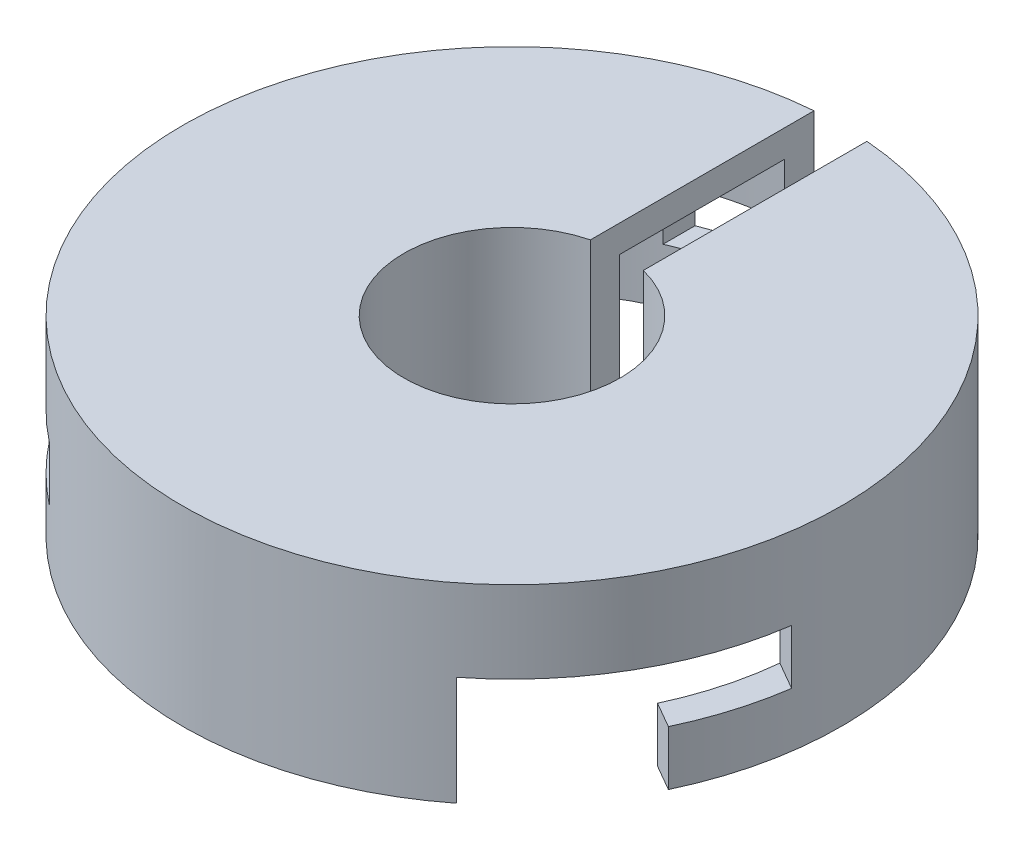
ISO-10303-21;
HEADER;
FILE_DESCRIPTION(('STEP AP214'),'2;1');
FILE_NAME('part.step','',(''),(''),'','','');
FILE_SCHEMA(('AUTOMOTIVE_DESIGN { 1 0 10303 214 1 1 1 1 }'));
ENDSEC;
DATA;
#1=APPLICATION_CONTEXT('core data for automotive mechanical design processes');
#2=APPLICATION_PROTOCOL_DEFINITION('international standard','automotive_design',2000,#1);
#3=PRODUCT_CONTEXT('',#1,'mechanical');
#4=PRODUCT('Part','Part','',(#3));
#5=PRODUCT_RELATED_PRODUCT_CATEGORY('part','',(#4));
#6=PRODUCT_DEFINITION_FORMATION('','',#4);
#7=PRODUCT_DEFINITION_CONTEXT('part definition',#1,'design');
#8=PRODUCT_DEFINITION('design','',#6,#7);
#9=PRODUCT_DEFINITION_SHAPE('','',#8);
#10=(LENGTH_UNIT() NAMED_UNIT(*) SI_UNIT(.MILLI.,.METRE.));
#11=(NAMED_UNIT(*) PLANE_ANGLE_UNIT() SI_UNIT($,.RADIAN.));
#12=(NAMED_UNIT(*) SI_UNIT($,.STERADIAN.) SOLID_ANGLE_UNIT());
#13=UNCERTAINTY_MEASURE_WITH_UNIT(LENGTH_MEASURE(1.E-05),#10,'distance_accuracy_value','');
#14=(GEOMETRIC_REPRESENTATION_CONTEXT(3) GLOBAL_UNCERTAINTY_ASSIGNED_CONTEXT((#13)) GLOBAL_UNIT_ASSIGNED_CONTEXT((#10,
#11,#12)) REPRESENTATION_CONTEXT('',''));
#15=CARTESIAN_POINT('',(0.,0.,0.));
#16=DIRECTION('',(0.,0.,1.));
#17=DIRECTION('',(1.,0.,0.));
#18=AXIS2_PLACEMENT_3D('',#15,#16,#17);
#19=CARTESIAN_POINT('',(-2.24999999999995,-7.,3.89711431702989));
#20=DIRECTION('',(0.5,0.,-0.866025403784439));
#21=DIRECTION('',(-0.866025403784439,0.,-0.5));
#22=AXIS2_PLACEMENT_3D('',#19,#20,#21);
#23=PLANE('',#22);
#24=DIRECTION('',(0.,1.,0.));
#25=VECTOR('',#24,1.);
#26=CARTESIAN_POINT('',(6.44266932535773,-7.,8.91582929200156));
#27=LINE('',#26,#25);
#28=CARTESIAN_POINT('',(6.44266932535773,-7.,8.91582929200156));
#29=VERTEX_POINT('',#28);
#30=CARTESIAN_POINT('',(6.44266932535773,-3.,8.91582929200156));
#31=VERTEX_POINT('',#30);
#32=EDGE_CURVE('E52',#29,#31,#27,.T.);
#33=ORIENTED_EDGE('',*,*,#32,.T.);
#34=DIRECTION('',(-0.866025403784439,0.,-0.5));
#35=VECTOR('',#34,1.);
#36=CARTESIAN_POINT('',(-2.24999999999995,-3.,3.89711431702989));
#37=LINE('',#36,#35);
#38=CARTESIAN_POINT('',(7.46078785093315,-3.,9.50364029680947));
#39=VERTEX_POINT('',#38);
#40=EDGE_CURVE('E57',#39,#31,#37,.T.);
#41=ORIENTED_EDGE('',*,*,#40,.F.);
#42=DIRECTION('',(0.,1.,0.));
#43=VECTOR('',#42,1.);
#44=CARTESIAN_POINT('',(7.46078785093315,-7.,9.50364029680947));
#45=LINE('',#44,#43);
#46=CARTESIAN_POINT('',(7.46078785093315,-7.,9.50364029680947));
#47=VERTEX_POINT('',#46);
#48=EDGE_CURVE('E381',#47,#39,#45,.T.);
#49=ORIENTED_EDGE('',*,*,#48,.F.);
#50=DIRECTION('',(-0.866025403784439,0.,-0.5));
#51=VECTOR('',#50,1.);
#52=CARTESIAN_POINT('',(-2.24999999999995,-7.,3.89711431702989));
#53=LINE('',#52,#51);
#54=EDGE_CURVE('E371',#47,#29,#53,.T.);
#55=ORIENTED_EDGE('',*,*,#54,.T.);
#56=EDGE_LOOP('',(#33,#41,#49,#55));
#57=FACE_BOUND('',#56,.T.);
#58=ADVANCED_FACE('F35',(#57),#23,.T.);
#59=CARTESIAN_POINT('',(2.25000000000006,-7.,-3.89711431703006));
#60=DIRECTION('',(0.500000000000001,0.,-0.866025403784438));
#61=DIRECTION('',(-0.866025403784438,0.,-0.500000000000001));
#62=AXIS2_PLACEMENT_3D('',#59,#60,#61);
#63=PLANE('',#62);
#64=DIRECTION('',(0.,1.,0.));
#65=VECTOR('',#64,1.);
#66=CARTESIAN_POINT('',(10.9426693253575,-7.,1.12160065794149));
#67=LINE('',#66,#65);
#68=CARTESIAN_POINT('',(10.9426693253575,-5.,1.12160065794149));
#69=VERTEX_POINT('',#68);
#70=CARTESIAN_POINT('',(10.9426693253575,-3.,1.12160065794149));
#71=VERTEX_POINT('',#70);
#72=EDGE_CURVE('E358',#69,#71,#67,.T.);
#73=ORIENTED_EDGE('',*,*,#72,.F.);
#74=DIRECTION('',(-0.866025403784438,0.,-0.500000000000001));
#75=VECTOR('',#74,1.);
#76=CARTESIAN_POINT('',(2.25000000000006,-5.,-3.89711431703006));
#77=LINE('',#76,#75);
#78=CARTESIAN_POINT('',(11.9607878509331,-5.,1.70941166274948));
#79=VERTEX_POINT('',#78);
#80=EDGE_CURVE('E255',#79,#69,#77,.T.);
#81=ORIENTED_EDGE('',*,*,#80,.F.);
#82=DIRECTION('',(0.,1.,0.));
#83=VECTOR('',#82,1.);
#84=CARTESIAN_POINT('',(11.9607878509331,-7.,1.70941166274948));
#85=LINE('',#84,#83);
#86=CARTESIAN_POINT('',(11.9607878509331,-3.,1.70941166274948));
#87=VERTEX_POINT('',#86);
#88=EDGE_CURVE('E357',#79,#87,#85,.T.);
#89=ORIENTED_EDGE('',*,*,#88,.T.);
#90=DIRECTION('',(-0.866025403784438,0.,-0.500000000000001));
#91=VECTOR('',#90,1.);
#92=CARTESIAN_POINT('',(2.25000000000006,-3.,-3.89711431703006));
#93=LINE('',#92,#91);
#94=EDGE_CURVE('E285',#87,#71,#93,.T.);
#95=ORIENTED_EDGE('',*,*,#94,.T.);
#96=EDGE_LOOP('',(#73,#81,#89,#95));
#97=FACE_BOUND('',#96,.T.);
#98=ADVANCED_FACE('F459',(#97),#63,.F.);
#99=CARTESIAN_POINT('',(2.25000000000045,-7.,3.89711431703076));
#100=DIRECTION('',(0.5,0.,0.866025403784439));
#101=DIRECTION('',(0.866025403784439,0.,-0.5));
#102=AXIS2_PLACEMENT_3D('',#99,#100,#101);
#103=PLANE('',#102);
#104=DIRECTION('',(0.,1.,0.));
#105=VECTOR('',#104,1.);
#106=CARTESIAN_POINT('',(-6.44266932535678,-7.,8.91582929200216));
#107=LINE('',#106,#105);
#108=CARTESIAN_POINT('',(-6.44266932535678,-5.,8.91582929200216));
#109=VERTEX_POINT('',#108);
#110=CARTESIAN_POINT('',(-6.44266932535678,-3.,8.91582929200216));
#111=VERTEX_POINT('',#110);
#112=EDGE_CURVE('E377',#109,#111,#107,.T.);
#113=ORIENTED_EDGE('',*,*,#112,.F.);
#114=DIRECTION('',(0.866025403784439,0.,-0.5));
#115=VECTOR('',#114,1.);
#116=CARTESIAN_POINT('',(2.25000000000045,-5.,3.89711431703076));
#117=LINE('',#116,#115);
#118=CARTESIAN_POINT('',(-7.4607878509323,-5.,9.50364029681013));
#119=VERTEX_POINT('',#118);
#120=EDGE_CURVE('E273',#119,#109,#117,.T.);
#121=ORIENTED_EDGE('',*,*,#120,.F.);
#122=DIRECTION('',(0.,1.,0.));
#123=VECTOR('',#122,1.);
#124=CARTESIAN_POINT('',(-7.4607878509323,-7.,9.50364029681013));
#125=LINE('',#124,#123);
#126=CARTESIAN_POINT('',(-7.4607878509323,-3.,9.50364029681013));
#127=VERTEX_POINT('',#126);
#128=EDGE_CURVE('E375',#119,#127,#125,.T.);
#129=ORIENTED_EDGE('',*,*,#128,.T.);
#130=DIRECTION('',(0.866025403784439,0.,-0.5));
#131=VECTOR('',#130,1.);
#132=CARTESIAN_POINT('',(2.25000000000045,-3.,3.89711431703076));
#133=LINE('',#132,#131);
#134=EDGE_CURVE('E297',#127,#111,#133,.T.);
#135=ORIENTED_EDGE('',*,*,#134,.T.);
#136=EDGE_LOOP('',(#113,#121,#129,#135));
#137=FACE_BOUND('',#136,.T.);
#138=ADVANCED_FACE('F464',(#137),#103,.F.);
#139=CARTESIAN_POINT('',(-2.24999999999955,-7.,-3.89711431702919));
#140=DIRECTION('',(0.5,0.,0.866025403784439));
#141=DIRECTION('',(0.866025403784439,0.,-0.5));
#142=AXIS2_PLACEMENT_3D('',#139,#140,#141);
#143=PLANE('',#142);
#144=DIRECTION('',(0.,1.,0.));
#145=VECTOR('',#144,1.);
#146=CARTESIAN_POINT('',(-10.942669325357,-7.,1.12160065794233));
#147=LINE('',#146,#145);
#148=CARTESIAN_POINT('',(-10.942669325357,-7.,1.12160065794233));
#149=VERTEX_POINT('',#148);
#150=CARTESIAN_POINT('',(-10.942669325357,-3.,1.12160065794233));
#151=VERTEX_POINT('',#150);
#152=EDGE_CURVE('E344',#149,#151,#147,.T.);
#153=ORIENTED_EDGE('',*,*,#152,.T.);
#154=DIRECTION('',(0.866025403784439,0.,-0.5));
#155=VECTOR('',#154,1.);
#156=CARTESIAN_POINT('',(-2.24999999999955,-3.,-3.89711431702919));
#157=LINE('',#156,#155);
#158=CARTESIAN_POINT('',(-11.9607878509329,-3.,1.70941166275055));
#159=VERTEX_POINT('',#158);
#160=EDGE_CURVE('E291',#159,#151,#157,.T.);
#161=ORIENTED_EDGE('',*,*,#160,.F.);
#162=DIRECTION('',(0.,1.,0.));
#163=VECTOR('',#162,1.);
#164=CARTESIAN_POINT('',(-11.9607878509329,-7.,1.70941166275055));
#165=LINE('',#164,#163);
#166=CARTESIAN_POINT('',(-11.9607878509329,-7.,1.70941166275055));
#167=VERTEX_POINT('',#166);
#168=EDGE_CURVE('E347',#167,#159,#165,.T.);
#169=ORIENTED_EDGE('',*,*,#168,.F.);
#170=DIRECTION('',(0.866025403784439,0.,-0.5));
#171=VECTOR('',#170,1.);
#172=CARTESIAN_POINT('',(-2.24999999999955,-7.,-3.89711431702919));
#173=LINE('',#172,#171);
#174=EDGE_CURVE('E217',#167,#149,#173,.T.);
#175=ORIENTED_EDGE('',*,*,#174,.T.);
#176=EDGE_LOOP('',(#153,#161,#169,#175));
#177=FACE_BOUND('',#176,.T.);
#178=ADVANCED_FACE('F475',(#177),#143,.T.);
#179=CARTESIAN_POINT('',(4.5,-7.,0.));
#180=DIRECTION('',(-1.,0.,0.));
#181=DIRECTION('',(0.,0.,1.));
#182=AXIS2_PLACEMENT_3D('',#179,#180,#181);
#183=PLANE('',#182);
#184=DIRECTION('',(0.,1.,0.));
#185=VECTOR('',#184,1.);
#186=CARTESIAN_POINT('',(4.5,-7.,-10.0374299499424));
#187=LINE('',#186,#185);
#188=CARTESIAN_POINT('',(4.5,-7.,-10.0374299499424));
#189=VERTEX_POINT('',#188);
#190=CARTESIAN_POINT('',(4.5,-3.,-10.0374299499424));
#191=VERTEX_POINT('',#190);
#192=EDGE_CURVE('E361',#189,#191,#187,.T.);
#193=ORIENTED_EDGE('',*,*,#192,.T.);
#194=DIRECTION('',(0.,0.,1.));
#195=VECTOR('',#194,1.);
#196=CARTESIAN_POINT('',(4.5,-3.,0.));
#197=LINE('',#196,#195);
#198=CARTESIAN_POINT('',(4.5,-3.,-11.2130519595591));
#199=VERTEX_POINT('',#198);
#200=EDGE_CURVE('E303',#199,#191,#197,.T.);
#201=ORIENTED_EDGE('',*,*,#200,.F.);
#202=DIRECTION('',(0.,1.,0.));
#203=VECTOR('',#202,1.);
#204=CARTESIAN_POINT('',(4.5,-7.,-11.2130519595591));
#205=LINE('',#204,#203);
#206=CARTESIAN_POINT('',(4.5,-7.,-11.2130519595591));
#207=VERTEX_POINT('',#206);
#208=EDGE_CURVE('E364',#207,#199,#205,.T.);
#209=ORIENTED_EDGE('',*,*,#208,.F.);
#210=DIRECTION('',(0.,0.,1.));
#211=VECTOR('',#210,1.);
#212=CARTESIAN_POINT('',(4.5,-7.,0.));
#213=LINE('',#212,#211);
#214=EDGE_CURVE('E352',#207,#189,#213,.T.);
#215=ORIENTED_EDGE('',*,*,#214,.T.);
#216=EDGE_LOOP('',(#193,#201,#209,#215));
#217=FACE_BOUND('',#216,.T.);
#218=ADVANCED_FACE('F432',(#217),#183,.T.);
#219=CARTESIAN_POINT('',(-4.5,-7.,0.));
#220=DIRECTION('',(-1.,0.,0.));
#221=DIRECTION('',(0.,0.,1.));
#222=AXIS2_PLACEMENT_3D('',#219,#220,#221);
#223=PLANE('',#222);
#224=DIRECTION('',(0.,1.,0.));
#225=VECTOR('',#224,1.);
#226=CARTESIAN_POINT('',(-4.5,-7.,-10.0374299499424));
#227=LINE('',#226,#225);
#228=CARTESIAN_POINT('',(-4.5,-5.,-10.0374299499424));
#229=VERTEX_POINT('',#228);
#230=CARTESIAN_POINT('',(-4.5,-3.,-10.0374299499424));
#231=VERTEX_POINT('',#230);
#232=EDGE_CURVE('E341',#229,#231,#227,.T.);
#233=ORIENTED_EDGE('',*,*,#232,.F.);
#234=DIRECTION('',(0.,0.,1.));
#235=VECTOR('',#234,1.);
#236=CARTESIAN_POINT('',(-4.5,-5.,0.));
#237=LINE('',#236,#235);
#238=CARTESIAN_POINT('',(-4.5,-5.,-11.2130519595591));
#239=VERTEX_POINT('',#238);
#240=EDGE_CURVE('E236',#239,#229,#237,.T.);
#241=ORIENTED_EDGE('',*,*,#240,.F.);
#242=DIRECTION('',(0.,1.,0.));
#243=VECTOR('',#242,1.);
#244=CARTESIAN_POINT('',(-4.5,-7.,-11.2130519595591));
#245=LINE('',#244,#243);
#246=CARTESIAN_POINT('',(-4.5,-3.,-11.2130519595591));
#247=VERTEX_POINT('',#246);
#248=EDGE_CURVE('E340',#239,#247,#245,.T.);
#249=ORIENTED_EDGE('',*,*,#248,.T.);
#250=DIRECTION('',(0.,0.,1.));
#251=VECTOR('',#250,1.);
#252=CARTESIAN_POINT('',(-4.5,-3.,0.));
#253=LINE('',#252,#251);
#254=EDGE_CURVE('E326',#247,#231,#253,.T.);
#255=ORIENTED_EDGE('',*,*,#254,.T.);
#256=EDGE_LOOP('',(#233,#241,#249,#255));
#257=FACE_BOUND('',#256,.T.);
#258=ADVANCED_FACE('F481',(#257),#223,.F.);
#259=CARTESIAN_POINT('',(0.,-7.,0.));
#260=DIRECTION('',(0.,1.,0.));
#261=DIRECTION('',(0.,0.,1.));
#262=AXIS2_PLACEMENT_3D('',#259,#260,#261);
#263=CYLINDRICAL_SURFACE('',#262,5.);
#264=DIRECTION('',(0.,1.,0.));
#265=VECTOR('',#264,1.);
#266=CARTESIAN_POINT('',(0.970071849064033,-7.,-4.90499343604591));
#267=LINE('',#266,#265);
#268=CARTESIAN_POINT('',(0.970071849064033,-7.,-4.90499343604591));
#269=VERTEX_POINT('',#268);
#270=CARTESIAN_POINT('',(0.970071849064033,-1.,-4.90499343604591));
#271=VERTEX_POINT('',#270);
#272=EDGE_CURVE('E44',#269,#271,#267,.T.);
#273=ORIENTED_EDGE('',*,*,#272,.T.);
#274=CARTESIAN_POINT('',(0.,-1.,0.));
#275=DIRECTION('',(0.,1.,0.));
#276=DIRECTION('',(0.,0.,1.));
#277=AXIS2_PLACEMENT_3D('',#274,#275,#276);
#278=CIRCLE('',#277,5.);
#279=CARTESIAN_POINT('',(-0.970071849064036,-1.,-4.90499343604591));
#280=VERTEX_POINT('',#279);
#281=EDGE_CURVE('E379',#280,#271,#278,.T.);
#282=ORIENTED_EDGE('',*,*,#281,.F.);
#283=DIRECTION('',(0.,1.,0.));
#284=VECTOR('',#283,1.);
#285=CARTESIAN_POINT('',(-0.970071849064036,-7.,-4.90499343604591));
#286=LINE('',#285,#284);
#287=CARTESIAN_POINT('',(-0.970071849064036,-7.,-4.90499343604591));
#288=VERTEX_POINT('',#287);
#289=EDGE_CURVE('E411',#288,#280,#286,.T.);
#290=ORIENTED_EDGE('',*,*,#289,.F.);
#291=CARTESIAN_POINT('',(0.,-7.,0.));
#292=DIRECTION('',(0.,1.,0.));
#293=DIRECTION('',(0.,0.,1.));
#294=AXIS2_PLACEMENT_3D('',#291,#292,#293);
#295=CIRCLE('',#294,5.);
#296=EDGE_CURVE('E398',#288,#269,#295,.T.);
#297=ORIENTED_EDGE('',*,*,#296,.T.);
#298=EDGE_LOOP('',(#273,#282,#290,#297));
#299=FACE_BOUND('',#298,.T.);
#300=ADVANCED_FACE('F444',(#299),#263,.T.);
#301=CARTESIAN_POINT('',(0.,-7.,0.));
#302=DIRECTION('',(0.,1.,0.));
#303=DIRECTION('',(0.,0.,1.));
#304=AXIS2_PLACEMENT_3D('',#301,#302,#303);
#305=CYLINDRICAL_SURFACE('',#304,3.96385270959813);
#306=CARTESIAN_POINT('',(0.,0.,0.));
#307=DIRECTION('',(0.,1.,0.));
#308=DIRECTION('',(0.,0.,1.));
#309=AXIS2_PLACEMENT_3D('',#306,#307,#308);
#310=CIRCLE('',#309,3.96385270959813);
#311=CARTESIAN_POINT('',(-0.970071849064037,0.,-3.84331743563317));
#312=VERTEX_POINT('',#311);
#313=CARTESIAN_POINT('',(0.970071849064034,0.,-3.84331743563317));
#314=VERTEX_POINT('',#313);
#315=EDGE_CURVE('E392',#312,#314,#310,.T.);
#316=ORIENTED_EDGE('',*,*,#315,.T.);
#317=DIRECTION('',(0.,1.,0.));
#318=VECTOR('',#317,1.);
#319=CARTESIAN_POINT('',(0.970071849064034,-7.,-3.84331743563317));
#320=LINE('',#319,#318);
#321=CARTESIAN_POINT('',(0.970071849064034,-7.,-3.84331743563317));
#322=VERTEX_POINT('',#321);
#323=EDGE_CURVE('E11',#322,#314,#320,.T.);
#324=ORIENTED_EDGE('',*,*,#323,.F.);
#325=CARTESIAN_POINT('',(0.,-7.,0.));
#326=DIRECTION('',(0.,1.,0.));
#327=DIRECTION('',(0.,0.,1.));
#328=AXIS2_PLACEMENT_3D('',#325,#326,#327);
#329=CIRCLE('',#328,3.96385270959813);
#330=CARTESIAN_POINT('',(-0.970071849064037,-7.,-3.84331743563317));
#331=VERTEX_POINT('',#330);
#332=EDGE_CURVE('E393',#331,#322,#329,.T.);
#333=ORIENTED_EDGE('',*,*,#332,.F.);
#334=DIRECTION('',(0.,1.,0.));
#335=VECTOR('',#334,1.);
#336=CARTESIAN_POINT('',(-0.970071849064037,-7.,-3.84331743563317));
#337=LINE('',#336,#335);
#338=EDGE_CURVE('E39',#331,#312,#337,.T.);
#339=ORIENTED_EDGE('',*,*,#338,.T.);
#340=EDGE_LOOP('',(#316,#324,#333,#339));
#341=FACE_BOUND('',#340,.T.);
#342=ADVANCED_FACE('F37',(#341),#305,.F.);
#343=CARTESIAN_POINT('',(0.970071849064035,-7.,0.));
#344=DIRECTION('',(-1.,0.,0.));
#345=DIRECTION('',(0.,0.,1.));
#346=AXIS2_PLACEMENT_3D('',#343,#344,#345);
#347=PLANE('',#346);
#348=DIRECTION('',(0.,0.,1.));
#349=VECTOR('',#348,1.);
#350=CARTESIAN_POINT('',(0.970071849064035,0.,0.));
#351=LINE('',#350,#349);
#352=CARTESIAN_POINT('',(0.970071849064031,0.,-12.0433174356332));
#353=VERTEX_POINT('',#352);
#354=EDGE_CURVE('E396',#353,#314,#351,.T.);
#355=ORIENTED_EDGE('',*,*,#354,.F.);
#356=DIRECTION('',(0.,1.,0.));
#357=VECTOR('',#356,1.);
#358=CARTESIAN_POINT('',(0.970071849064031,-3.,-12.0433174356332));
#359=LINE('',#358,#357);
#360=CARTESIAN_POINT('',(0.970071849064031,-3.,-12.0433174356332));
#361=VERTEX_POINT('',#360);
#362=EDGE_CURVE('E314',#361,#353,#359,.T.);
#363=ORIENTED_EDGE('',*,*,#362,.F.);
#364=DIRECTION('',(0.,0.,1.));
#365=VECTOR('',#364,1.);
#366=CARTESIAN_POINT('',(0.970071849064035,-3.,0.));
#367=LINE('',#366,#365);
#368=CARTESIAN_POINT('',(0.970071849064031,-3.,-10.9571419908502));
#369=VERTEX_POINT('',#368);
#370=EDGE_CURVE('E309',#361,#369,#367,.T.);
#371=ORIENTED_EDGE('',*,*,#370,.T.);
#372=DIRECTION('',(0.,1.,0.));
#373=VECTOR('',#372,1.);
#374=CARTESIAN_POINT('',(0.970071849064031,-3.,-10.9571419908502));
#375=LINE('',#374,#373);
#376=CARTESIAN_POINT('',(0.970071849064031,-1.,-10.9571419908502));
#377=VERTEX_POINT('',#376);
#378=EDGE_CURVE('E315',#369,#377,#375,.T.);
#379=ORIENTED_EDGE('',*,*,#378,.T.);
#380=DIRECTION('',(0.,0.,1.));
#381=VECTOR('',#380,1.);
#382=CARTESIAN_POINT('',(0.970071849064035,-1.,0.));
#383=LINE('',#382,#381);
#384=EDGE_CURVE('E389',#377,#271,#383,.T.);
#385=ORIENTED_EDGE('',*,*,#384,.T.);
#386=ORIENTED_EDGE('',*,*,#272,.F.);
#387=DIRECTION('',(0.,0.,1.));
#388=VECTOR('',#387,1.);
#389=CARTESIAN_POINT('',(0.970071849064035,-7.,0.));
#390=LINE('',#389,#388);
#391=EDGE_CURVE('E401',#269,#322,#390,.T.);
#392=ORIENTED_EDGE('',*,*,#391,.T.);
#393=ORIENTED_EDGE('',*,*,#323,.T.);
#394=EDGE_LOOP('',(#355,#363,#371,#379,#385,#386,#392,#393));
#395=FACE_BOUND('',#394,.T.);
#396=ADVANCED_FACE('F426',(#395),#347,.T.);
#397=CARTESIAN_POINT('',(-0.970071849064037,-7.,0.));
#398=DIRECTION('',(-1.,0.,0.));
#399=DIRECTION('',(0.,0.,1.));
#400=AXIS2_PLACEMENT_3D('',#397,#398,#399);
#401=PLANE('',#400);
#402=DIRECTION('',(0.,0.,1.));
#403=VECTOR('',#402,1.);
#404=CARTESIAN_POINT('',(-0.970071849064037,0.,0.));
#405=LINE('',#404,#403);
#406=CARTESIAN_POINT('',(-0.970071849064035,0.,-12.0433174356332));
#407=VERTEX_POINT('',#406);
#408=EDGE_CURVE('E406',#407,#312,#405,.T.);
#409=ORIENTED_EDGE('',*,*,#408,.T.);
#410=ORIENTED_EDGE('',*,*,#338,.F.);
#411=DIRECTION('',(0.,0.,1.));
#412=VECTOR('',#411,1.);
#413=CARTESIAN_POINT('',(-0.970071849064037,-7.,0.));
#414=LINE('',#413,#412);
#415=EDGE_CURVE('E395',#288,#331,#414,.T.);
#416=ORIENTED_EDGE('',*,*,#415,.F.);
#417=ORIENTED_EDGE('',*,*,#289,.T.);
#418=DIRECTION('',(0.,0.,1.));
#419=VECTOR('',#418,1.);
#420=CARTESIAN_POINT('',(-0.970071849064037,-1.,0.));
#421=LINE('',#420,#419);
#422=CARTESIAN_POINT('',(-0.970071849064036,-1.,-10.9571419908502));
#423=VERTEX_POINT('',#422);
#424=EDGE_CURVE('E385',#423,#280,#421,.T.);
#425=ORIENTED_EDGE('',*,*,#424,.F.);
#426=DIRECTION('',(0.,1.,0.));
#427=VECTOR('',#426,1.);
#428=CARTESIAN_POINT('',(-0.970071849064036,-3.,-10.9571419908502));
#429=LINE('',#428,#427);
#430=CARTESIAN_POINT('',(-0.970071849064036,-3.,-10.9571419908502));
#431=VERTEX_POINT('',#430);
#432=EDGE_CURVE('E220',#431,#423,#429,.T.);
#433=ORIENTED_EDGE('',*,*,#432,.F.);
#434=DIRECTION('',(0.,0.,1.));
#435=VECTOR('',#434,1.);
#436=CARTESIAN_POINT('',(-0.970071849064037,-3.,0.));
#437=LINE('',#436,#435);
#438=CARTESIAN_POINT('',(-0.970071849064035,-3.,-12.0433174356332));
#439=VERTEX_POINT('',#438);
#440=EDGE_CURVE('E318',#439,#431,#437,.T.);
#441=ORIENTED_EDGE('',*,*,#440,.F.);
#442=DIRECTION('',(0.,1.,0.));
#443=VECTOR('',#442,1.);
#444=CARTESIAN_POINT('',(-0.970071849064035,-3.,-12.0433174356332));
#445=LINE('',#444,#443);
#446=EDGE_CURVE('E332',#439,#407,#445,.T.);
#447=ORIENTED_EDGE('',*,*,#446,.T.);
#448=EDGE_LOOP('',(#409,#410,#416,#417,#425,#433,#441,#447));
#449=FACE_BOUND('',#448,.T.);
#450=ADVANCED_FACE('F449',(#449),#401,.F.);
#451=CARTESIAN_POINT('',(0.,-7.,0.));
#452=DIRECTION('',(0.,1.,0.));
#453=DIRECTION('',(0.,0.,1.));
#454=AXIS2_PLACEMENT_3D('',#451,#452,#453);
#455=PLANE('',#454);
#456=ORIENTED_EDGE('',*,*,#332,.T.);
#457=ORIENTED_EDGE('',*,*,#391,.F.);
#458=ORIENTED_EDGE('',*,*,#296,.F.);
#459=ORIENTED_EDGE('',*,*,#415,.T.);
#460=EDGE_LOOP('',(#456,#457,#458,#459));
#461=FACE_BOUND('',#460,.T.);
#462=ADVANCED_FACE('F448',(#461),#455,.F.);
#463=CARTESIAN_POINT('',(0.,0.,0.));
#464=DIRECTION('',(0.,1.,0.));
#465=DIRECTION('',(0.,0.,1.));
#466=AXIS2_PLACEMENT_3D('',#463,#464,#465);
#467=PLANE('',#466);
#468=CARTESIAN_POINT('',(0.,0.,0.));
#469=DIRECTION('',(0.,1.,0.));
#470=DIRECTION('',(0.,0.,1.));
#471=AXIS2_PLACEMENT_3D('',#468,#469,#470);
#472=CIRCLE('',#471,12.0823232140087);
#473=EDGE_CURVE('E360',#407,#353,#472,.T.);
#474=ORIENTED_EDGE('',*,*,#473,.T.);
#475=ORIENTED_EDGE('',*,*,#354,.T.);
#476=ORIENTED_EDGE('',*,*,#315,.F.);
#477=ORIENTED_EDGE('',*,*,#408,.F.);
#478=EDGE_LOOP('',(#474,#475,#476,#477));
#479=FACE_BOUND('',#478,.T.);
#480=ADVANCED_FACE('F423',(#479),#467,.T.);
#481=CARTESIAN_POINT('',(0.,-1.,0.));
#482=DIRECTION('',(0.,1.,0.));
#483=DIRECTION('',(0.,0.,1.));
#484=AXIS2_PLACEMENT_3D('',#481,#482,#483);
#485=PLANE('',#484);
#486=ORIENTED_EDGE('',*,*,#281,.T.);
#487=ORIENTED_EDGE('',*,*,#384,.F.);
#488=CARTESIAN_POINT('',(0.,-1.,0.));
#489=DIRECTION('',(0.,1.,0.));
#490=DIRECTION('',(0.,0.,1.));
#491=AXIS2_PLACEMENT_3D('',#488,#489,#490);
#492=CIRCLE('',#491,11.);
#493=EDGE_CURVE('E387',#423,#377,#492,.T.);
#494=ORIENTED_EDGE('',*,*,#493,.F.);
#495=ORIENTED_EDGE('',*,*,#424,.T.);
#496=EDGE_LOOP('',(#486,#487,#494,#495));
#497=FACE_BOUND('',#496,.T.);
#498=ADVANCED_FACE('F441',(#497),#485,.F.);
#499=CARTESIAN_POINT('',(0.,-7.,0.));
#500=DIRECTION('',(0.,1.,0.));
#501=DIRECTION('',(0.,0.,1.));
#502=AXIS2_PLACEMENT_3D('',#499,#500,#501);
#503=CYLINDRICAL_SURFACE('',#502,11.);
#504=CARTESIAN_POINT('',(0.,-7.,0.));
#505=DIRECTION('',(0.,1.,0.));
#506=DIRECTION('',(0.,0.,1.));
#507=AXIS2_PLACEMENT_3D('',#504,#505,#506);
#508=CIRCLE('',#507,11.);
#509=CARTESIAN_POINT('',(-9.00412739241755,-7.,6.31867786021063));
#510=VERTEX_POINT('',#509);
#511=EDGE_CURVE('E373',#510,#29,#508,.T.);
#512=ORIENTED_EDGE('',*,*,#511,.F.);
#513=DIRECTION('',(0.,1.,0.));
#514=VECTOR('',#513,1.);
#515=CARTESIAN_POINT('',(-9.00412739241755,-7.,6.31867786021063));
#516=LINE('',#515,#514);
#517=CARTESIAN_POINT('',(-9.00412739241755,-5.,6.31867786021063));
#518=VERTEX_POINT('',#517);
#519=EDGE_CURVE('E277',#510,#518,#516,.T.);
#520=ORIENTED_EDGE('',*,*,#519,.T.);
#521=CARTESIAN_POINT('',(0.,-5.,0.));
#522=DIRECTION('',(0.,1.,0.));
#523=DIRECTION('',(0.,0.,1.));
#524=AXIS2_PLACEMENT_3D('',#521,#522,#523);
#525=CIRCLE('',#524,11.);
#526=EDGE_CURVE('E268',#518,#109,#525,.T.);
#527=ORIENTED_EDGE('',*,*,#526,.T.);
#528=ORIENTED_EDGE('',*,*,#112,.T.);
#529=CARTESIAN_POINT('',(0.,-3.,0.));
#530=DIRECTION('',(0.,1.,0.));
#531=DIRECTION('',(0.,0.,1.));
#532=AXIS2_PLACEMENT_3D('',#529,#530,#531);
#533=CIRCLE('',#532,11.);
#534=EDGE_CURVE('E300',#151,#111,#533,.T.);
#535=ORIENTED_EDGE('',*,*,#534,.F.);
#536=ORIENTED_EDGE('',*,*,#152,.F.);
#537=CARTESIAN_POINT('',(0.,-7.,0.));
#538=DIRECTION('',(0.,1.,0.));
#539=DIRECTION('',(0.,0.,1.));
#540=AXIS2_PLACEMENT_3D('',#537,#538,#539);
#541=CIRCLE('',#540,11.);
#542=CARTESIAN_POINT('',(-0.970071849064036,-7.,-10.9571419908502));
#543=VERTEX_POINT('',#542);
#544=EDGE_CURVE('E338',#543,#149,#541,.T.);
#545=ORIENTED_EDGE('',*,*,#544,.F.);
#546=DIRECTION('',(0.,1.,0.));
#547=VECTOR('',#546,1.);
#548=CARTESIAN_POINT('',(-0.970071849064036,-7.,-10.9571419908502));
#549=LINE('',#548,#547);
#550=CARTESIAN_POINT('',(-0.970071849064036,-5.,-10.9571419908502));
#551=VERTEX_POINT('',#550);
#552=EDGE_CURVE('E230',#543,#551,#549,.T.);
#553=ORIENTED_EDGE('',*,*,#552,.T.);
#554=CARTESIAN_POINT('',(0.,-5.,0.));
#555=DIRECTION('',(0.,1.,0.));
#556=DIRECTION('',(0.,0.,1.));
#557=AXIS2_PLACEMENT_3D('',#554,#555,#556);
#558=CIRCLE('',#557,11.);
#559=EDGE_CURVE('E234',#551,#229,#558,.T.);
#560=ORIENTED_EDGE('',*,*,#559,.T.);
#561=ORIENTED_EDGE('',*,*,#232,.T.);
#562=CARTESIAN_POINT('',(0.,-3.,0.));
#563=DIRECTION('',(0.,1.,0.));
#564=DIRECTION('',(0.,0.,1.));
#565=AXIS2_PLACEMENT_3D('',#562,#563,#564);
#566=CIRCLE('',#565,11.);
#567=EDGE_CURVE('E329',#431,#231,#566,.T.);
#568=ORIENTED_EDGE('',*,*,#567,.F.);
#569=ORIENTED_EDGE('',*,*,#432,.T.);
#570=ORIENTED_EDGE('',*,*,#493,.T.);
#571=ORIENTED_EDGE('',*,*,#378,.F.);
#572=CARTESIAN_POINT('',(0.,-3.,0.));
#573=DIRECTION('',(0.,1.,0.));
#574=DIRECTION('',(0.,0.,1.));
#575=AXIS2_PLACEMENT_3D('',#572,#573,#574);
#576=CIRCLE('',#575,11.);
#577=EDGE_CURVE('E312',#191,#369,#576,.T.);
#578=ORIENTED_EDGE('',*,*,#577,.F.);
#579=ORIENTED_EDGE('',*,*,#192,.F.);
#580=CARTESIAN_POINT('',(0.,-7.,0.));
#581=DIRECTION('',(0.,1.,0.));
#582=DIRECTION('',(0.,0.,1.));
#583=AXIS2_PLACEMENT_3D('',#580,#581,#582);
#584=CIRCLE('',#583,11.);
#585=CARTESIAN_POINT('',(9.9741992414815,-7.,4.63846413063956));
#586=VERTEX_POINT('',#585);
#587=EDGE_CURVE('E355',#586,#189,#584,.T.);
#588=ORIENTED_EDGE('',*,*,#587,.F.);
#589=DIRECTION('',(0.,1.,0.));
#590=VECTOR('',#589,1.);
#591=CARTESIAN_POINT('',(9.9741992414815,-7.,4.63846413063956));
#592=LINE('',#591,#590);
#593=CARTESIAN_POINT('',(9.9741992414815,-5.,4.63846413063956));
#594=VERTEX_POINT('',#593);
#595=EDGE_CURVE('E259',#586,#594,#592,.T.);
#596=ORIENTED_EDGE('',*,*,#595,.T.);
#597=CARTESIAN_POINT('',(0.,-5.,0.));
#598=DIRECTION('',(0.,1.,0.));
#599=DIRECTION('',(0.,0.,1.));
#600=AXIS2_PLACEMENT_3D('',#597,#598,#599);
#601=CIRCLE('',#600,11.);
#602=EDGE_CURVE('E250',#594,#69,#601,.T.);
#603=ORIENTED_EDGE('',*,*,#602,.T.);
#604=ORIENTED_EDGE('',*,*,#72,.T.);
#605=CARTESIAN_POINT('',(0.,-3.,0.));
#606=DIRECTION('',(0.,1.,0.));
#607=DIRECTION('',(0.,0.,1.));
#608=AXIS2_PLACEMENT_3D('',#605,#606,#607);
#609=CIRCLE('',#608,11.);
#610=EDGE_CURVE('E288',#31,#71,#609,.T.);
#611=ORIENTED_EDGE('',*,*,#610,.F.);
#612=ORIENTED_EDGE('',*,*,#32,.F.);
#613=EDGE_LOOP('',(#512,#520,#527,#528,#535,#536,#545,#553,#560,#561,#568,#569,#570,#571,#578,
#579,#588,#596,#603,#604,#611,#612));
#614=FACE_BOUND('',#613,.T.);
#615=ADVANCED_FACE('F436',(#614),#503,.F.);
#616=CARTESIAN_POINT('',(0.,-7.,0.));
#617=DIRECTION('',(0.,1.,0.));
#618=DIRECTION('',(0.,0.,1.));
#619=AXIS2_PLACEMENT_3D('',#616,#617,#618);
#620=CYLINDRICAL_SURFACE('',#619,12.0823232140087);
#621=ORIENTED_EDGE('',*,*,#473,.F.);
#622=ORIENTED_EDGE('',*,*,#446,.F.);
#623=CARTESIAN_POINT('',(0.,-3.,0.));
#624=DIRECTION('',(0.,1.,0.));
#625=DIRECTION('',(0.,0.,1.));
#626=AXIS2_PLACEMENT_3D('',#623,#624,#625);
#627=CIRCLE('',#626,12.0823232140087);
#628=EDGE_CURVE('E323',#439,#247,#627,.T.);
#629=ORIENTED_EDGE('',*,*,#628,.T.);
#630=ORIENTED_EDGE('',*,*,#248,.F.);
#631=CARTESIAN_POINT('',(0.,-5.,0.));
#632=DIRECTION('',(0.,1.,0.));
#633=DIRECTION('',(0.,0.,1.));
#634=AXIS2_PLACEMENT_3D('',#631,#632,#633);
#635=CIRCLE('',#634,12.0823232140087);
#636=CARTESIAN_POINT('',(-0.970071849064035,-5.,-12.0433174356332));
#637=VERTEX_POINT('',#636);
#638=EDGE_CURVE('E226',#637,#239,#635,.T.);
#639=ORIENTED_EDGE('',*,*,#638,.F.);
#640=DIRECTION('',(0.,1.,0.));
#641=VECTOR('',#640,1.);
#642=CARTESIAN_POINT('',(-0.970071849064035,-7.,-12.0433174356332));
#643=LINE('',#642,#641);
#644=CARTESIAN_POINT('',(-0.970071849064035,-7.,-12.0433174356332));
#645=VERTEX_POINT('',#644);
#646=EDGE_CURVE('E223',#645,#637,#643,.T.);
#647=ORIENTED_EDGE('',*,*,#646,.F.);
#648=CARTESIAN_POINT('',(0.,-7.,0.));
#649=DIRECTION('',(0.,1.,0.));
#650=DIRECTION('',(0.,0.,1.));
#651=AXIS2_PLACEMENT_3D('',#648,#649,#650);
#652=CIRCLE('',#651,12.0823232140087);
#653=EDGE_CURVE('E210',#645,#167,#652,.T.);
#654=ORIENTED_EDGE('',*,*,#653,.T.);
#655=ORIENTED_EDGE('',*,*,#168,.T.);
#656=CARTESIAN_POINT('',(0.,-3.,0.));
#657=DIRECTION('',(0.,1.,0.));
#658=DIRECTION('',(0.,0.,1.));
#659=AXIS2_PLACEMENT_3D('',#656,#657,#658);
#660=CIRCLE('',#659,12.0823232140087);
#661=EDGE_CURVE('E294',#159,#127,#660,.T.);
#662=ORIENTED_EDGE('',*,*,#661,.T.);
#663=ORIENTED_EDGE('',*,*,#128,.F.);
#664=CARTESIAN_POINT('',(0.,-5.,0.));
#665=DIRECTION('',(0.,1.,0.));
#666=DIRECTION('',(0.,0.,1.));
#667=AXIS2_PLACEMENT_3D('',#664,#665,#666);
#668=CIRCLE('',#667,12.0823232140087);
#669=CARTESIAN_POINT('',(-9.94478292056643,-5.,6.86176558260209));
#670=VERTEX_POINT('',#669);
#671=EDGE_CURVE('E271',#670,#119,#668,.T.);
#672=ORIENTED_EDGE('',*,*,#671,.F.);
#673=DIRECTION('',(0.,1.,0.));
#674=VECTOR('',#673,1.);
#675=CARTESIAN_POINT('',(-9.94478292056643,-7.,6.86176558260209));
#676=LINE('',#675,#674);
#677=CARTESIAN_POINT('',(-9.94478292056643,-7.,6.86176558260209));
#678=VERTEX_POINT('',#677);
#679=EDGE_CURVE('E267',#678,#670,#676,.T.);
#680=ORIENTED_EDGE('',*,*,#679,.F.);
#681=CARTESIAN_POINT('',(0.,-7.,0.));
#682=DIRECTION('',(0.,1.,0.));
#683=DIRECTION('',(0.,0.,1.));
#684=AXIS2_PLACEMENT_3D('',#681,#682,#683);
#685=CIRCLE('',#684,12.0823232140087);
#686=EDGE_CURVE('E368',#678,#47,#685,.T.);
#687=ORIENTED_EDGE('',*,*,#686,.T.);
#688=ORIENTED_EDGE('',*,*,#48,.T.);
#689=CARTESIAN_POINT('',(0.,-3.,0.));
#690=DIRECTION('',(0.,1.,0.));
#691=DIRECTION('',(0.,0.,1.));
#692=AXIS2_PLACEMENT_3D('',#689,#690,#691);
#693=CIRCLE('',#692,12.0823232140087);
#694=EDGE_CURVE('E282',#39,#87,#693,.T.);
#695=ORIENTED_EDGE('',*,*,#694,.T.);
#696=ORIENTED_EDGE('',*,*,#88,.F.);
#697=CARTESIAN_POINT('',(0.,-5.,0.));
#698=DIRECTION('',(0.,1.,0.));
#699=DIRECTION('',(0.,0.,1.));
#700=AXIS2_PLACEMENT_3D('',#697,#698,#699);
#701=CIRCLE('',#700,12.0823232140087);
#702=CARTESIAN_POINT('',(10.9148547696304,-5.,5.18155185303104));
#703=VERTEX_POINT('',#702);
#704=EDGE_CURVE('E253',#703,#79,#701,.T.);
#705=ORIENTED_EDGE('',*,*,#704,.F.);
#706=DIRECTION('',(0.,1.,0.));
#707=VECTOR('',#706,1.);
#708=CARTESIAN_POINT('',(10.9148547696304,-7.,5.18155185303104));
#709=LINE('',#708,#707);
#710=CARTESIAN_POINT('',(10.9148547696304,-7.,5.18155185303104));
#711=VERTEX_POINT('',#710);
#712=EDGE_CURVE('E249',#711,#703,#709,.T.);
#713=ORIENTED_EDGE('',*,*,#712,.F.);
#714=CARTESIAN_POINT('',(0.,-7.,0.));
#715=DIRECTION('',(0.,1.,0.));
#716=DIRECTION('',(0.,0.,1.));
#717=AXIS2_PLACEMENT_3D('',#714,#715,#716);
#718=CIRCLE('',#717,12.0823232140087);
#719=EDGE_CURVE('E343',#711,#207,#718,.T.);
#720=ORIENTED_EDGE('',*,*,#719,.T.);
#721=ORIENTED_EDGE('',*,*,#208,.T.);
#722=CARTESIAN_POINT('',(0.,-3.,0.));
#723=DIRECTION('',(0.,1.,0.));
#724=DIRECTION('',(0.,0.,1.));
#725=AXIS2_PLACEMENT_3D('',#722,#723,#724);
#726=CIRCLE('',#725,12.0823232140087);
#727=EDGE_CURVE('E306',#199,#361,#726,.T.);
#728=ORIENTED_EDGE('',*,*,#727,.T.);
#729=ORIENTED_EDGE('',*,*,#362,.T.);
#730=EDGE_LOOP('',(#621,#622,#629,#630,#639,#647,#654,#655,#662,#663,#672,#680,#687,#688,#695,
#696,#705,#713,#720,#721,#728,#729));
#731=FACE_BOUND('',#730,.T.);
#732=ADVANCED_FACE('F224',(#731),#620,.T.);
#733=CARTESIAN_POINT('',(0.,-7.,0.));
#734=DIRECTION('',(0.,1.,0.));
#735=DIRECTION('',(0.,0.,1.));
#736=AXIS2_PLACEMENT_3D('',#733,#734,#735);
#737=PLANE('',#736);
#738=ORIENTED_EDGE('',*,*,#686,.F.);
#739=DIRECTION('',(0.866025403784443,0.,-0.499999999999992));
#740=VECTOR('',#739,1.);
#741=CARTESIAN_POINT('',(0.485035924532011,-7.,0.840106864785604));
#742=LINE('',#741,#740);
#743=EDGE_CURVE('E264',#678,#510,#742,.T.);
#744=ORIENTED_EDGE('',*,*,#743,.T.);
#745=ORIENTED_EDGE('',*,*,#511,.T.);
#746=ORIENTED_EDGE('',*,*,#54,.F.);
#747=EDGE_LOOP('',(#738,#744,#745,#746));
#748=FACE_BOUND('',#747,.T.);
#749=ADVANCED_FACE('F472',(#748),#737,.F.);
#750=CARTESIAN_POINT('',(0.,-7.,0.));
#751=DIRECTION('',(0.,1.,0.));
#752=DIRECTION('',(0.,0.,1.));
#753=AXIS2_PLACEMENT_3D('',#750,#751,#752);
#754=PLANE('',#753);
#755=ORIENTED_EDGE('',*,*,#719,.F.);
#756=DIRECTION('',(-0.866025403784436,0.,-0.500000000000004));
#757=VECTOR('',#756,1.);
#758=CARTESIAN_POINT('',(0.485035924532022,-7.,-0.840106864785596));
#759=LINE('',#758,#757);
#760=EDGE_CURVE('E246',#711,#586,#759,.T.);
#761=ORIENTED_EDGE('',*,*,#760,.T.);
#762=ORIENTED_EDGE('',*,*,#587,.T.);
#763=ORIENTED_EDGE('',*,*,#214,.F.);
#764=EDGE_LOOP('',(#755,#761,#762,#763));
#765=FACE_BOUND('',#764,.T.);
#766=ADVANCED_FACE('F496',(#765),#754,.F.);
#767=CARTESIAN_POINT('',(0.,-7.,0.));
#768=DIRECTION('',(0.,1.,0.));
#769=DIRECTION('',(0.,0.,1.));
#770=AXIS2_PLACEMENT_3D('',#767,#768,#769);
#771=PLANE('',#770);
#772=ORIENTED_EDGE('',*,*,#653,.F.);
#773=DIRECTION('',(0.,0.,1.));
#774=VECTOR('',#773,1.);
#775=CARTESIAN_POINT('',(-0.970071849064037,-7.,0.));
#776=LINE('',#775,#774);
#777=EDGE_CURVE('E214',#645,#543,#776,.T.);
#778=ORIENTED_EDGE('',*,*,#777,.T.);
#779=ORIENTED_EDGE('',*,*,#544,.T.);
#780=ORIENTED_EDGE('',*,*,#174,.F.);
#781=EDGE_LOOP('',(#772,#778,#779,#780));
#782=FACE_BOUND('',#781,.T.);
#783=ADVANCED_FACE('F212',(#782),#771,.F.);
#784=CARTESIAN_POINT('',(0.,-3.,0.));
#785=DIRECTION('',(0.,1.,0.));
#786=DIRECTION('',(0.,0.,1.));
#787=AXIS2_PLACEMENT_3D('',#784,#785,#786);
#788=PLANE('',#787);
#789=ORIENTED_EDGE('',*,*,#440,.T.);
#790=ORIENTED_EDGE('',*,*,#567,.T.);
#791=ORIENTED_EDGE('',*,*,#254,.F.);
#792=ORIENTED_EDGE('',*,*,#628,.F.);
#793=EDGE_LOOP('',(#789,#790,#791,#792));
#794=FACE_BOUND('',#793,.T.);
#795=ADVANCED_FACE('F550',(#794),#788,.F.);
#796=CARTESIAN_POINT('',(0.,-3.,0.));
#797=DIRECTION('',(0.,1.,0.));
#798=DIRECTION('',(0.,0.,1.));
#799=AXIS2_PLACEMENT_3D('',#796,#797,#798);
#800=PLANE('',#799);
#801=ORIENTED_EDGE('',*,*,#200,.T.);
#802=ORIENTED_EDGE('',*,*,#577,.T.);
#803=ORIENTED_EDGE('',*,*,#370,.F.);
#804=ORIENTED_EDGE('',*,*,#727,.F.);
#805=EDGE_LOOP('',(#801,#802,#803,#804));
#806=FACE_BOUND('',#805,.T.);
#807=ADVANCED_FACE('F430',(#806),#800,.F.);
#808=CARTESIAN_POINT('',(0.,-3.,0.));
#809=DIRECTION('',(0.,1.,0.));
#810=DIRECTION('',(0.,0.,1.));
#811=AXIS2_PLACEMENT_3D('',#808,#809,#810);
#812=PLANE('',#811);
#813=ORIENTED_EDGE('',*,*,#160,.T.);
#814=ORIENTED_EDGE('',*,*,#534,.T.);
#815=ORIENTED_EDGE('',*,*,#134,.F.);
#816=ORIENTED_EDGE('',*,*,#661,.F.);
#817=EDGE_LOOP('',(#813,#814,#815,#816));
#818=FACE_BOUND('',#817,.T.);
#819=ADVANCED_FACE('F544',(#818),#812,.F.);
#820=CARTESIAN_POINT('',(0.,-3.,0.));
#821=DIRECTION('',(0.,1.,0.));
#822=DIRECTION('',(0.,0.,1.));
#823=AXIS2_PLACEMENT_3D('',#820,#821,#822);
#824=PLANE('',#823);
#825=ORIENTED_EDGE('',*,*,#40,.T.);
#826=ORIENTED_EDGE('',*,*,#610,.T.);
#827=ORIENTED_EDGE('',*,*,#94,.F.);
#828=ORIENTED_EDGE('',*,*,#694,.F.);
#829=EDGE_LOOP('',(#825,#826,#827,#828));
#830=FACE_BOUND('',#829,.T.);
#831=ADVANCED_FACE('F516',(#830),#824,.F.);
#832=CARTESIAN_POINT('',(0.485035924532011,-7.,0.840106864785604));
#833=DIRECTION('',(0.499999999999992,0.,0.866025403784443));
#834=DIRECTION('',(0.866025403784443,0.,-0.499999999999992));
#835=AXIS2_PLACEMENT_3D('',#832,#833,#834);
#836=PLANE('',#835);
#837=DIRECTION('',(0.866025403784443,0.,-0.499999999999992));
#838=VECTOR('',#837,1.);
#839=CARTESIAN_POINT('',(0.485035924532011,-5.,0.840106864785604));
#840=LINE('',#839,#838);
#841=EDGE_CURVE('E262',#670,#518,#840,.T.);
#842=ORIENTED_EDGE('',*,*,#841,.T.);
#843=ORIENTED_EDGE('',*,*,#519,.F.);
#844=ORIENTED_EDGE('',*,*,#743,.F.);
#845=ORIENTED_EDGE('',*,*,#679,.T.);
#846=EDGE_LOOP('',(#842,#843,#844,#845));
#847=FACE_BOUND('',#846,.T.);
#848=ADVANCED_FACE('F511',(#847),#836,.F.);
#849=CARTESIAN_POINT('',(0.,-5.,0.));
#850=DIRECTION('',(0.,1.,0.));
#851=DIRECTION('',(0.,0.,1.));
#852=AXIS2_PLACEMENT_3D('',#849,#850,#851);
#853=PLANE('',#852);
#854=ORIENTED_EDGE('',*,*,#841,.F.);
#855=ORIENTED_EDGE('',*,*,#671,.T.);
#856=ORIENTED_EDGE('',*,*,#120,.T.);
#857=ORIENTED_EDGE('',*,*,#526,.F.);
#858=EDGE_LOOP('',(#854,#855,#856,#857));
#859=FACE_BOUND('',#858,.T.);
#860=ADVANCED_FACE('F529',(#859),#853,.T.);
#861=CARTESIAN_POINT('',(0.485035924532022,-7.,-0.840106864785596));
#862=DIRECTION('',(0.500000000000004,0.,-0.866025403784436));
#863=DIRECTION('',(-0.866025403784436,0.,-0.500000000000004));
#864=AXIS2_PLACEMENT_3D('',#861,#862,#863);
#865=PLANE('',#864);
#866=DIRECTION('',(-0.866025403784436,0.,-0.500000000000004));
#867=VECTOR('',#866,1.);
#868=CARTESIAN_POINT('',(0.485035924532022,-5.,-0.840106864785596));
#869=LINE('',#868,#867);
#870=EDGE_CURVE('E244',#703,#594,#869,.T.);
#871=ORIENTED_EDGE('',*,*,#870,.T.);
#872=ORIENTED_EDGE('',*,*,#595,.F.);
#873=ORIENTED_EDGE('',*,*,#760,.F.);
#874=ORIENTED_EDGE('',*,*,#712,.T.);
#875=EDGE_LOOP('',(#871,#872,#873,#874));
#876=FACE_BOUND('',#875,.T.);
#877=ADVANCED_FACE('F527',(#876),#865,.F.);
#878=CARTESIAN_POINT('',(0.,-5.,0.));
#879=DIRECTION('',(0.,1.,0.));
#880=DIRECTION('',(0.,0.,1.));
#881=AXIS2_PLACEMENT_3D('',#878,#879,#880);
#882=PLANE('',#881);
#883=ORIENTED_EDGE('',*,*,#870,.F.);
#884=ORIENTED_EDGE('',*,*,#704,.T.);
#885=ORIENTED_EDGE('',*,*,#80,.T.);
#886=ORIENTED_EDGE('',*,*,#602,.F.);
#887=EDGE_LOOP('',(#883,#884,#885,#886));
#888=FACE_BOUND('',#887,.T.);
#889=ADVANCED_FACE('F524',(#888),#882,.T.);
#890=CARTESIAN_POINT('',(-0.970071849064037,-7.,0.));
#891=DIRECTION('',(-1.,0.,0.));
#892=DIRECTION('',(0.,0.,1.));
#893=AXIS2_PLACEMENT_3D('',#890,#891,#892);
#894=PLANE('',#893);
#895=DIRECTION('',(0.,0.,1.));
#896=VECTOR('',#895,1.);
#897=CARTESIAN_POINT('',(-0.970071849064037,-5.,0.));
#898=LINE('',#897,#896);
#899=EDGE_CURVE('E239',#637,#551,#898,.T.);
#900=ORIENTED_EDGE('',*,*,#899,.T.);
#901=ORIENTED_EDGE('',*,*,#552,.F.);
#902=ORIENTED_EDGE('',*,*,#777,.F.);
#903=ORIENTED_EDGE('',*,*,#646,.T.);
#904=EDGE_LOOP('',(#900,#901,#902,#903));
#905=FACE_BOUND('',#904,.T.);
#906=ADVANCED_FACE('F232',(#905),#894,.F.);
#907=CARTESIAN_POINT('',(0.,-5.,0.));
#908=DIRECTION('',(0.,1.,0.));
#909=DIRECTION('',(0.,0.,1.));
#910=AXIS2_PLACEMENT_3D('',#907,#908,#909);
#911=PLANE('',#910);
#912=ORIENTED_EDGE('',*,*,#899,.F.);
#913=ORIENTED_EDGE('',*,*,#638,.T.);
#914=ORIENTED_EDGE('',*,*,#240,.T.);
#915=ORIENTED_EDGE('',*,*,#559,.F.);
#916=EDGE_LOOP('',(#912,#913,#914,#915));
#917=FACE_BOUND('',#916,.T.);
#918=ADVANCED_FACE('F603',(#917),#911,.T.);
#919=CLOSED_SHELL('',(#58,#98,#138,#178,#218,#258,#300,#342,#396,#450,#462,#480,#498,#615,#732,
#749,#766,#783,#795,#807,#819,#831,#848,#860,#877,#889,#906,#918));
#920=MANIFOLD_SOLID_BREP('B2',#919);
#921=ADVANCED_BREP_SHAPE_REPRESENTATION('',(#18,#920),#14);
#922=SHAPE_DEFINITION_REPRESENTATION(#9,#921);
ENDSEC;
END-ISO-10303-21;
